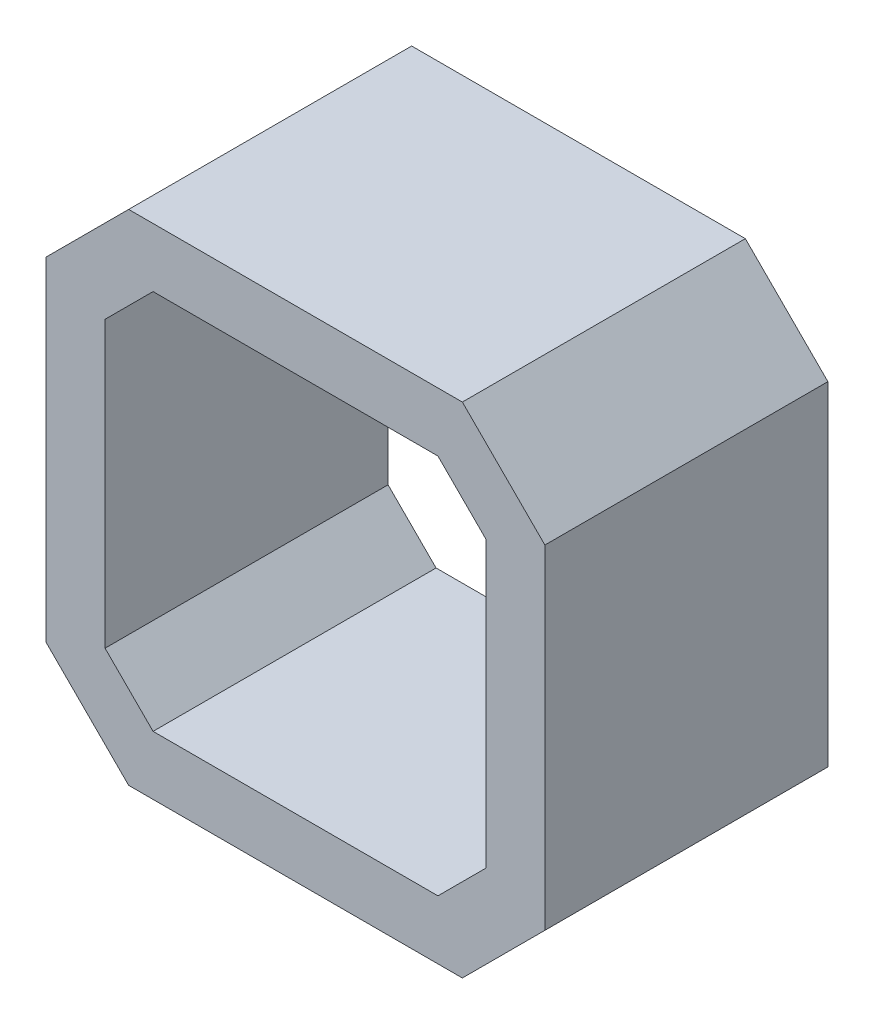
ISO-10303-21;
HEADER;
FILE_DESCRIPTION(('STEP AP214'),'2;1');
FILE_NAME('part.step','',(''),(''),'','','');
FILE_SCHEMA(('AUTOMOTIVE_DESIGN { 1 0 10303 214 1 1 1 1 }'));
ENDSEC;
DATA;
#1=APPLICATION_CONTEXT('core data for automotive mechanical design processes');
#2=APPLICATION_PROTOCOL_DEFINITION('international standard','automotive_design',2000,#1);
#3=PRODUCT_CONTEXT('',#1,'mechanical');
#4=PRODUCT('Part','Part','',(#3));
#5=PRODUCT_RELATED_PRODUCT_CATEGORY('part','',(#4));
#6=PRODUCT_DEFINITION_FORMATION('','',#4);
#7=PRODUCT_DEFINITION_CONTEXT('part definition',#1,'design');
#8=PRODUCT_DEFINITION('design','',#6,#7);
#9=PRODUCT_DEFINITION_SHAPE('','',#8);
#10=(LENGTH_UNIT() NAMED_UNIT(*) SI_UNIT(.MILLI.,.METRE.));
#11=(NAMED_UNIT(*) PLANE_ANGLE_UNIT() SI_UNIT($,.RADIAN.));
#12=(NAMED_UNIT(*) SI_UNIT($,.STERADIAN.) SOLID_ANGLE_UNIT());
#13=UNCERTAINTY_MEASURE_WITH_UNIT(LENGTH_MEASURE(1.E-05),#10,'distance_accuracy_value','');
#14=(GEOMETRIC_REPRESENTATION_CONTEXT(3) GLOBAL_UNCERTAINTY_ASSIGNED_CONTEXT((#13)) GLOBAL_UNIT_ASSIGNED_CONTEXT((#10,
#11,#12)) REPRESENTATION_CONTEXT('',''));
#15=CARTESIAN_POINT('',(0.,0.,0.));
#16=DIRECTION('',(0.,0.,1.));
#17=DIRECTION('',(1.,0.,0.));
#18=AXIS2_PLACEMENT_3D('',#15,#16,#17);
#19=CARTESIAN_POINT('',(0.,0.,24.));
#20=DIRECTION('',(0.,0.,-1.));
#21=DIRECTION('',(-1.,0.,0.));
#22=AXIS2_PLACEMENT_3D('',#19,#20,#21);
#23=PLANE('',#22);
#24=DIRECTION('',(-1.,0.,0.));
#25=VECTOR('',#24,1.);
#26=CARTESIAN_POINT('',(14.15,21.15,24.));
#27=LINE('',#26,#25);
#28=CARTESIAN_POINT('',(14.15,21.15,24.));
#29=VERTEX_POINT('',#28);
#30=CARTESIAN_POINT('',(-14.15,21.15,24.));
#31=VERTEX_POINT('',#30);
#32=EDGE_CURVE('E211',#29,#31,#27,.T.);
#33=ORIENTED_EDGE('',*,*,#32,.T.);
#34=DIRECTION('',(-0.707106781186547,-0.707106781186547,0.));
#35=VECTOR('',#34,1.);
#36=CARTESIAN_POINT('',(-14.15,21.15,24.));
#37=LINE('',#36,#35);
#38=CARTESIAN_POINT('',(-21.15,14.15,24.));
#39=VERTEX_POINT('',#38);
#40=EDGE_CURVE('E214',#31,#39,#37,.T.);
#41=ORIENTED_EDGE('',*,*,#40,.T.);
#42=DIRECTION('',(0.,-1.,0.));
#43=VECTOR('',#42,1.);
#44=CARTESIAN_POINT('',(-21.15,-14.15,24.));
#45=LINE('',#44,#43);
#46=CARTESIAN_POINT('',(-21.15,-14.15,24.));
#47=VERTEX_POINT('',#46);
#48=EDGE_CURVE('E217',#39,#47,#45,.T.);
#49=ORIENTED_EDGE('',*,*,#48,.T.);
#50=DIRECTION('',(0.707106781186547,-0.707106781186547,0.));
#51=VECTOR('',#50,1.);
#52=CARTESIAN_POINT('',(-14.15,-21.15,24.));
#53=LINE('',#52,#51);
#54=CARTESIAN_POINT('',(-14.15,-21.15,24.));
#55=VERTEX_POINT('',#54);
#56=EDGE_CURVE('E219',#47,#55,#53,.T.);
#57=ORIENTED_EDGE('',*,*,#56,.T.);
#58=DIRECTION('',(1.,0.,0.));
#59=VECTOR('',#58,1.);
#60=CARTESIAN_POINT('',(14.15,-21.15,24.));
#61=LINE('',#60,#59);
#62=CARTESIAN_POINT('',(14.15,-21.15,24.));
#63=VERTEX_POINT('',#62);
#64=EDGE_CURVE('E221',#55,#63,#61,.T.);
#65=ORIENTED_EDGE('',*,*,#64,.T.);
#66=DIRECTION('',(0.707106781186547,0.707106781186547,0.));
#67=VECTOR('',#66,1.);
#68=CARTESIAN_POINT('',(21.15,-14.15,24.));
#69=LINE('',#68,#67);
#70=CARTESIAN_POINT('',(21.15,-14.15,24.));
#71=VERTEX_POINT('',#70);
#72=EDGE_CURVE('E223',#63,#71,#69,.T.);
#73=ORIENTED_EDGE('',*,*,#72,.T.);
#74=DIRECTION('',(0.,1.,0.));
#75=VECTOR('',#74,1.);
#76=CARTESIAN_POINT('',(21.15,-14.15,24.));
#77=LINE('',#76,#75);
#78=CARTESIAN_POINT('',(21.15,14.15,24.));
#79=VERTEX_POINT('',#78);
#80=EDGE_CURVE('E225',#71,#79,#77,.T.);
#81=ORIENTED_EDGE('',*,*,#80,.T.);
#82=DIRECTION('',(-0.707106781186547,0.707106781186547,0.));
#83=VECTOR('',#82,1.);
#84=CARTESIAN_POINT('',(21.15,14.15,24.));
#85=LINE('',#84,#83);
#86=EDGE_CURVE('E227',#79,#29,#85,.T.);
#87=ORIENTED_EDGE('',*,*,#86,.T.);
#88=EDGE_LOOP('',(#33,#41,#49,#57,#65,#73,#81,#87));
#89=FACE_BOUND('',#88,.T.);
#90=DIRECTION('',(-1.,0.,0.));
#91=VECTOR('',#90,1.);
#92=CARTESIAN_POINT('',(12.0789321881345,16.15,24.));
#93=LINE('',#92,#91);
#94=CARTESIAN_POINT('',(12.0789321881345,16.15,24.));
#95=VERTEX_POINT('',#94);
#96=CARTESIAN_POINT('',(-12.0789321881345,16.15,24.));
#97=VERTEX_POINT('',#96);
#98=EDGE_CURVE('E146',#95,#97,#93,.T.);
#99=ORIENTED_EDGE('',*,*,#98,.F.);
#100=DIRECTION('',(-0.707106781186547,0.707106781186547,0.));
#101=VECTOR('',#100,1.);
#102=CARTESIAN_POINT('',(16.15,12.0789321881345,24.));
#103=LINE('',#102,#101);
#104=CARTESIAN_POINT('',(16.15,12.0789321881345,24.));
#105=VERTEX_POINT('',#104);
#106=EDGE_CURVE('E179',#105,#95,#103,.T.);
#107=ORIENTED_EDGE('',*,*,#106,.F.);
#108=DIRECTION('',(0.,1.,0.));
#109=VECTOR('',#108,1.);
#110=CARTESIAN_POINT('',(16.15,-12.0789321881345,24.));
#111=LINE('',#110,#109);
#112=CARTESIAN_POINT('',(16.15,-12.0789321881345,24.));
#113=VERTEX_POINT('',#112);
#114=EDGE_CURVE('E177',#113,#105,#111,.T.);
#115=ORIENTED_EDGE('',*,*,#114,.F.);
#116=DIRECTION('',(0.707106781186547,0.707106781186547,0.));
#117=VECTOR('',#116,1.);
#118=CARTESIAN_POINT('',(16.15,-12.0789321881345,24.));
#119=LINE('',#118,#117);
#120=CARTESIAN_POINT('',(12.0789321881345,-16.15,24.));
#121=VERTEX_POINT('',#120);
#122=EDGE_CURVE('E175',#121,#113,#119,.T.);
#123=ORIENTED_EDGE('',*,*,#122,.F.);
#124=DIRECTION('',(1.,0.,0.));
#125=VECTOR('',#124,1.);
#126=CARTESIAN_POINT('',(12.0789321881345,-16.15,24.));
#127=LINE('',#126,#125);
#128=CARTESIAN_POINT('',(-12.0789321881345,-16.15,24.));
#129=VERTEX_POINT('',#128);
#130=EDGE_CURVE('E173',#129,#121,#127,.T.);
#131=ORIENTED_EDGE('',*,*,#130,.F.);
#132=DIRECTION('',(0.707106781186548,-0.707106781186548,0.));
#133=VECTOR('',#132,1.);
#134=CARTESIAN_POINT('',(-12.0789321881345,-16.15,24.));
#135=LINE('',#134,#133);
#136=CARTESIAN_POINT('',(-16.15,-12.0789321881345,24.));
#137=VERTEX_POINT('',#136);
#138=EDGE_CURVE('E169',#137,#129,#135,.T.);
#139=ORIENTED_EDGE('',*,*,#138,.F.);
#140=DIRECTION('',(0.,-1.,0.));
#141=VECTOR('',#140,1.);
#142=CARTESIAN_POINT('',(-16.15,-12.0789321881345,24.));
#143=LINE('',#142,#141);
#144=CARTESIAN_POINT('',(-16.15,12.0789321881345,24.));
#145=VERTEX_POINT('',#144);
#146=EDGE_CURVE('E167',#145,#137,#143,.T.);
#147=ORIENTED_EDGE('',*,*,#146,.F.);
#148=DIRECTION('',(-0.707106781186547,-0.707106781186547,0.));
#149=VECTOR('',#148,1.);
#150=CARTESIAN_POINT('',(-12.0789321881345,16.15,24.));
#151=LINE('',#150,#149);
#152=EDGE_CURVE('E154',#97,#145,#151,.T.);
#153=ORIENTED_EDGE('',*,*,#152,.F.);
#154=EDGE_LOOP('',(#99,#107,#115,#123,#131,#139,#147,#153));
#155=FACE_BOUND('',#154,.T.);
#156=ADVANCED_FACE('F33',(#89,#155),#23,.F.);
#157=CARTESIAN_POINT('',(0.,0.,0.));
#158=DIRECTION('',(0.,0.,-1.));
#159=DIRECTION('',(-1.,0.,0.));
#160=AXIS2_PLACEMENT_3D('',#157,#158,#159);
#161=PLANE('',#160);
#162=DIRECTION('',(-1.,0.,0.));
#163=VECTOR('',#162,1.);
#164=CARTESIAN_POINT('',(14.15,21.15,0.));
#165=LINE('',#164,#163);
#166=CARTESIAN_POINT('',(14.15,21.15,0.));
#167=VERTEX_POINT('',#166);
#168=CARTESIAN_POINT('',(-14.15,21.15,0.));
#169=VERTEX_POINT('',#168);
#170=EDGE_CURVE('E162',#167,#169,#165,.T.);
#171=ORIENTED_EDGE('',*,*,#170,.F.);
#172=DIRECTION('',(-0.707106781186547,0.707106781186547,0.));
#173=VECTOR('',#172,1.);
#174=CARTESIAN_POINT('',(21.15,14.15,0.));
#175=LINE('',#174,#173);
#176=CARTESIAN_POINT('',(21.15,14.15,0.));
#177=VERTEX_POINT('',#176);
#178=EDGE_CURVE('E215',#177,#167,#175,.T.);
#179=ORIENTED_EDGE('',*,*,#178,.F.);
#180=DIRECTION('',(0.,1.,0.));
#181=VECTOR('',#180,1.);
#182=CARTESIAN_POINT('',(21.15,-14.15,0.));
#183=LINE('',#182,#181);
#184=CARTESIAN_POINT('',(21.15,-14.15,0.));
#185=VERTEX_POINT('',#184);
#186=EDGE_CURVE('E242',#185,#177,#183,.T.);
#187=ORIENTED_EDGE('',*,*,#186,.F.);
#188=DIRECTION('',(0.707106781186547,0.707106781186547,0.));
#189=VECTOR('',#188,1.);
#190=CARTESIAN_POINT('',(21.15,-14.15,0.));
#191=LINE('',#190,#189);
#192=CARTESIAN_POINT('',(14.15,-21.15,0.));
#193=VERTEX_POINT('',#192);
#194=EDGE_CURVE('E240',#193,#185,#191,.T.);
#195=ORIENTED_EDGE('',*,*,#194,.F.);
#196=DIRECTION('',(1.,0.,0.));
#197=VECTOR('',#196,1.);
#198=CARTESIAN_POINT('',(14.15,-21.15,0.));
#199=LINE('',#198,#197);
#200=CARTESIAN_POINT('',(-14.15,-21.15,0.));
#201=VERTEX_POINT('',#200);
#202=EDGE_CURVE('E238',#201,#193,#199,.T.);
#203=ORIENTED_EDGE('',*,*,#202,.F.);
#204=DIRECTION('',(0.707106781186547,-0.707106781186547,0.));
#205=VECTOR('',#204,1.);
#206=CARTESIAN_POINT('',(-14.15,-21.15,0.));
#207=LINE('',#206,#205);
#208=CARTESIAN_POINT('',(-21.15,-14.15,0.));
#209=VERTEX_POINT('',#208);
#210=EDGE_CURVE('E236',#209,#201,#207,.T.);
#211=ORIENTED_EDGE('',*,*,#210,.F.);
#212=DIRECTION('',(0.,-1.,0.));
#213=VECTOR('',#212,1.);
#214=CARTESIAN_POINT('',(-21.15,-14.15,0.));
#215=LINE('',#214,#213);
#216=CARTESIAN_POINT('',(-21.15,14.15,0.));
#217=VERTEX_POINT('',#216);
#218=EDGE_CURVE('E234',#217,#209,#215,.T.);
#219=ORIENTED_EDGE('',*,*,#218,.F.);
#220=DIRECTION('',(-0.707106781186547,-0.707106781186547,0.));
#221=VECTOR('',#220,1.);
#222=CARTESIAN_POINT('',(-14.15,21.15,0.));
#223=LINE('',#222,#221);
#224=EDGE_CURVE('E232',#169,#217,#223,.T.);
#225=ORIENTED_EDGE('',*,*,#224,.F.);
#226=EDGE_LOOP('',(#171,#179,#187,#195,#203,#211,#219,#225));
#227=FACE_BOUND('',#226,.T.);
#228=DIRECTION('',(-0.707106781186547,0.707106781186547,0.));
#229=VECTOR('',#228,1.);
#230=CARTESIAN_POINT('',(16.15,12.0789321881345,0.));
#231=LINE('',#230,#229);
#232=CARTESIAN_POINT('',(16.15,12.0789321881345,0.));
#233=VERTEX_POINT('',#232);
#234=CARTESIAN_POINT('',(12.0789321881345,16.15,0.));
#235=VERTEX_POINT('',#234);
#236=EDGE_CURVE('E155',#233,#235,#231,.T.);
#237=ORIENTED_EDGE('',*,*,#236,.T.);
#238=DIRECTION('',(-1.,0.,0.));
#239=VECTOR('',#238,1.);
#240=CARTESIAN_POINT('',(12.0789321881345,16.15,0.));
#241=LINE('',#240,#239);
#242=CARTESIAN_POINT('',(-12.0789321881345,16.15,0.));
#243=VERTEX_POINT('',#242);
#244=EDGE_CURVE('E56',#235,#243,#241,.T.);
#245=ORIENTED_EDGE('',*,*,#244,.T.);
#246=DIRECTION('',(-0.707106781186547,-0.707106781186547,0.));
#247=VECTOR('',#246,1.);
#248=CARTESIAN_POINT('',(-12.0789321881345,16.15,0.));
#249=LINE('',#248,#247);
#250=CARTESIAN_POINT('',(-16.15,12.0789321881345,0.));
#251=VERTEX_POINT('',#250);
#252=EDGE_CURVE('E161',#243,#251,#249,.T.);
#253=ORIENTED_EDGE('',*,*,#252,.T.);
#254=DIRECTION('',(0.,-1.,0.));
#255=VECTOR('',#254,1.);
#256=CARTESIAN_POINT('',(-16.15,-12.0789321881345,0.));
#257=LINE('',#256,#255);
#258=CARTESIAN_POINT('',(-16.15,-12.0789321881345,0.));
#259=VERTEX_POINT('',#258);
#260=EDGE_CURVE('E183',#251,#259,#257,.T.);
#261=ORIENTED_EDGE('',*,*,#260,.T.);
#262=DIRECTION('',(0.707106781186548,-0.707106781186548,0.));
#263=VECTOR('',#262,1.);
#264=CARTESIAN_POINT('',(-12.0789321881345,-16.15,0.));
#265=LINE('',#264,#263);
#266=CARTESIAN_POINT('',(-12.0789321881345,-16.15,0.));
#267=VERTEX_POINT('',#266);
#268=EDGE_CURVE('E186',#259,#267,#265,.T.);
#269=ORIENTED_EDGE('',*,*,#268,.T.);
#270=DIRECTION('',(1.,0.,0.));
#271=VECTOR('',#270,1.);
#272=CARTESIAN_POINT('',(12.0789321881345,-16.15,0.));
#273=LINE('',#272,#271);
#274=CARTESIAN_POINT('',(12.0789321881345,-16.15,0.));
#275=VERTEX_POINT('',#274);
#276=EDGE_CURVE('E189',#267,#275,#273,.T.);
#277=ORIENTED_EDGE('',*,*,#276,.T.);
#278=DIRECTION('',(0.707106781186547,0.707106781186547,0.));
#279=VECTOR('',#278,1.);
#280=CARTESIAN_POINT('',(16.15,-12.0789321881345,0.));
#281=LINE('',#280,#279);
#282=CARTESIAN_POINT('',(16.15,-12.0789321881345,0.));
#283=VERTEX_POINT('',#282);
#284=EDGE_CURVE('E192',#275,#283,#281,.T.);
#285=ORIENTED_EDGE('',*,*,#284,.T.);
#286=DIRECTION('',(0.,1.,0.));
#287=VECTOR('',#286,1.);
#288=CARTESIAN_POINT('',(16.15,-12.0789321881345,0.));
#289=LINE('',#288,#287);
#290=EDGE_CURVE('E195',#283,#233,#289,.T.);
#291=ORIENTED_EDGE('',*,*,#290,.T.);
#292=EDGE_LOOP('',(#237,#245,#253,#261,#269,#277,#285,#291));
#293=FACE_BOUND('',#292,.T.);
#294=ADVANCED_FACE('F272',(#227,#293),#161,.T.);
#295=CARTESIAN_POINT('',(14.15,21.15,24.));
#296=DIRECTION('',(0.,-1.,0.));
#297=DIRECTION('',(0.,0.,-1.));
#298=AXIS2_PLACEMENT_3D('',#295,#296,#297);
#299=PLANE('',#298);
#300=ORIENTED_EDGE('',*,*,#170,.T.);
#301=DIRECTION('',(0.,0.,-1.));
#302=VECTOR('',#301,1.);
#303=CARTESIAN_POINT('',(-14.15,21.15,24.));
#304=LINE('',#303,#302);
#305=EDGE_CURVE('E11',#31,#169,#304,.T.);
#306=ORIENTED_EDGE('',*,*,#305,.F.);
#307=ORIENTED_EDGE('',*,*,#32,.F.);
#308=DIRECTION('',(0.,0.,-1.));
#309=VECTOR('',#308,1.);
#310=CARTESIAN_POINT('',(14.15,21.15,24.));
#311=LINE('',#310,#309);
#312=EDGE_CURVE('E229',#29,#167,#311,.T.);
#313=ORIENTED_EDGE('',*,*,#312,.T.);
#314=EDGE_LOOP('',(#300,#306,#307,#313));
#315=FACE_BOUND('',#314,.T.);
#316=ADVANCED_FACE('F35',(#315),#299,.F.);
#317=CARTESIAN_POINT('',(-14.15,21.15,24.));
#318=DIRECTION('',(0.707106781186548,-0.707106781186548,0.));
#319=DIRECTION('',(0.707106781186548,0.707106781186548,0.));
#320=AXIS2_PLACEMENT_3D('',#317,#318,#319);
#321=PLANE('',#320);
#322=ORIENTED_EDGE('',*,*,#224,.T.);
#323=DIRECTION('',(0.,0.,-1.));
#324=VECTOR('',#323,1.);
#325=CARTESIAN_POINT('',(-21.15,14.15,24.));
#326=LINE('',#325,#324);
#327=EDGE_CURVE('E41',#39,#217,#326,.T.);
#328=ORIENTED_EDGE('',*,*,#327,.F.);
#329=ORIENTED_EDGE('',*,*,#40,.F.);
#330=ORIENTED_EDGE('',*,*,#305,.T.);
#331=EDGE_LOOP('',(#322,#328,#329,#330));
#332=FACE_BOUND('',#331,.T.);
#333=ADVANCED_FACE('F289',(#332),#321,.F.);
#334=CARTESIAN_POINT('',(-21.15,-14.15,24.));
#335=DIRECTION('',(1.,0.,0.));
#336=DIRECTION('',(0.,0.,-1.));
#337=AXIS2_PLACEMENT_3D('',#334,#335,#336);
#338=PLANE('',#337);
#339=ORIENTED_EDGE('',*,*,#218,.T.);
#340=DIRECTION('',(0.,0.,-1.));
#341=VECTOR('',#340,1.);
#342=CARTESIAN_POINT('',(-21.15,-14.15,24.));
#343=LINE('',#342,#341);
#344=EDGE_CURVE('E259',#47,#209,#343,.T.);
#345=ORIENTED_EDGE('',*,*,#344,.F.);
#346=ORIENTED_EDGE('',*,*,#48,.F.);
#347=ORIENTED_EDGE('',*,*,#327,.T.);
#348=EDGE_LOOP('',(#339,#345,#346,#347));
#349=FACE_BOUND('',#348,.T.);
#350=ADVANCED_FACE('F266',(#349),#338,.F.);
#351=CARTESIAN_POINT('',(-14.15,-21.15,24.));
#352=DIRECTION('',(0.707106781186548,0.707106781186548,0.));
#353=DIRECTION('',(-0.707106781186548,0.707106781186548,0.));
#354=AXIS2_PLACEMENT_3D('',#351,#352,#353);
#355=PLANE('',#354);
#356=ORIENTED_EDGE('',*,*,#210,.T.);
#357=DIRECTION('',(0.,0.,-1.));
#358=VECTOR('',#357,1.);
#359=CARTESIAN_POINT('',(-14.15,-21.15,24.));
#360=LINE('',#359,#358);
#361=EDGE_CURVE('E256',#55,#201,#360,.T.);
#362=ORIENTED_EDGE('',*,*,#361,.F.);
#363=ORIENTED_EDGE('',*,*,#56,.F.);
#364=ORIENTED_EDGE('',*,*,#344,.T.);
#365=EDGE_LOOP('',(#356,#362,#363,#364));
#366=FACE_BOUND('',#365,.T.);
#367=ADVANCED_FACE('F278',(#366),#355,.F.);
#368=CARTESIAN_POINT('',(14.15,-21.15,24.));
#369=DIRECTION('',(0.,1.,0.));
#370=DIRECTION('',(-1.,0.,0.));
#371=AXIS2_PLACEMENT_3D('',#368,#369,#370);
#372=PLANE('',#371);
#373=ORIENTED_EDGE('',*,*,#202,.T.);
#374=DIRECTION('',(0.,0.,-1.));
#375=VECTOR('',#374,1.);
#376=CARTESIAN_POINT('',(14.15,-21.15,24.));
#377=LINE('',#376,#375);
#378=EDGE_CURVE('E253',#63,#193,#377,.T.);
#379=ORIENTED_EDGE('',*,*,#378,.F.);
#380=ORIENTED_EDGE('',*,*,#64,.F.);
#381=ORIENTED_EDGE('',*,*,#361,.T.);
#382=EDGE_LOOP('',(#373,#379,#380,#381));
#383=FACE_BOUND('',#382,.T.);
#384=ADVANCED_FACE('F282',(#383),#372,.F.);
#385=CARTESIAN_POINT('',(21.15,-14.15,24.));
#386=DIRECTION('',(-0.707106781186548,0.707106781186548,0.));
#387=DIRECTION('',(-0.707106781186548,-0.707106781186548,0.));
#388=AXIS2_PLACEMENT_3D('',#385,#386,#387);
#389=PLANE('',#388);
#390=ORIENTED_EDGE('',*,*,#194,.T.);
#391=DIRECTION('',(0.,0.,-1.));
#392=VECTOR('',#391,1.);
#393=CARTESIAN_POINT('',(21.15,-14.15,24.));
#394=LINE('',#393,#392);
#395=EDGE_CURVE('E250',#71,#185,#394,.T.);
#396=ORIENTED_EDGE('',*,*,#395,.F.);
#397=ORIENTED_EDGE('',*,*,#72,.F.);
#398=ORIENTED_EDGE('',*,*,#378,.T.);
#399=EDGE_LOOP('',(#390,#396,#397,#398));
#400=FACE_BOUND('',#399,.T.);
#401=ADVANCED_FACE('F302',(#400),#389,.F.);
#402=CARTESIAN_POINT('',(21.15,-14.15,24.));
#403=DIRECTION('',(-1.,0.,0.));
#404=DIRECTION('',(0.,0.,1.));
#405=AXIS2_PLACEMENT_3D('',#402,#403,#404);
#406=PLANE('',#405);
#407=ORIENTED_EDGE('',*,*,#186,.T.);
#408=DIRECTION('',(0.,0.,-1.));
#409=VECTOR('',#408,1.);
#410=CARTESIAN_POINT('',(21.15,14.15,24.));
#411=LINE('',#410,#409);
#412=EDGE_CURVE('E247',#79,#177,#411,.T.);
#413=ORIENTED_EDGE('',*,*,#412,.F.);
#414=ORIENTED_EDGE('',*,*,#80,.F.);
#415=ORIENTED_EDGE('',*,*,#395,.T.);
#416=EDGE_LOOP('',(#407,#413,#414,#415));
#417=FACE_BOUND('',#416,.T.);
#418=ADVANCED_FACE('F300',(#417),#406,.F.);
#419=CARTESIAN_POINT('',(21.15,14.15,24.));
#420=DIRECTION('',(-0.707106781186548,-0.707106781186548,0.));
#421=DIRECTION('',(0.707106781186548,-0.707106781186548,0.));
#422=AXIS2_PLACEMENT_3D('',#419,#420,#421);
#423=PLANE('',#422);
#424=ORIENTED_EDGE('',*,*,#178,.T.);
#425=ORIENTED_EDGE('',*,*,#312,.F.);
#426=ORIENTED_EDGE('',*,*,#86,.F.);
#427=ORIENTED_EDGE('',*,*,#412,.T.);
#428=EDGE_LOOP('',(#424,#425,#426,#427));
#429=FACE_BOUND('',#428,.T.);
#430=ADVANCED_FACE('F295',(#429),#423,.F.);
#431=CARTESIAN_POINT('',(12.0789321881345,16.15,24.));
#432=DIRECTION('',(0.,-1.,0.));
#433=DIRECTION('',(0.,0.,-1.));
#434=AXIS2_PLACEMENT_3D('',#431,#432,#433);
#435=PLANE('',#434);
#436=ORIENTED_EDGE('',*,*,#244,.F.);
#437=DIRECTION('',(0.,0.,-1.));
#438=VECTOR('',#437,1.);
#439=CARTESIAN_POINT('',(12.0789321881345,16.15,24.));
#440=LINE('',#439,#438);
#441=EDGE_CURVE('E150',#95,#235,#440,.T.);
#442=ORIENTED_EDGE('',*,*,#441,.F.);
#443=ORIENTED_EDGE('',*,*,#98,.T.);
#444=DIRECTION('',(0.,0.,-1.));
#445=VECTOR('',#444,1.);
#446=CARTESIAN_POINT('',(-12.0789321881345,16.15,24.));
#447=LINE('',#446,#445);
#448=EDGE_CURVE('E149',#97,#243,#447,.T.);
#449=ORIENTED_EDGE('',*,*,#448,.T.);
#450=EDGE_LOOP('',(#436,#442,#443,#449));
#451=FACE_BOUND('',#450,.T.);
#452=ADVANCED_FACE('F148',(#451),#435,.T.);
#453=CARTESIAN_POINT('',(-12.0789321881345,16.15,24.));
#454=DIRECTION('',(0.707106781186548,-0.707106781186548,0.));
#455=DIRECTION('',(0.707106781186548,0.707106781186548,0.));
#456=AXIS2_PLACEMENT_3D('',#453,#454,#455);
#457=PLANE('',#456);
#458=ORIENTED_EDGE('',*,*,#252,.F.);
#459=ORIENTED_EDGE('',*,*,#448,.F.);
#460=ORIENTED_EDGE('',*,*,#152,.T.);
#461=DIRECTION('',(0.,0.,-1.));
#462=VECTOR('',#461,1.);
#463=CARTESIAN_POINT('',(-16.15,12.0789321881345,24.));
#464=LINE('',#463,#462);
#465=EDGE_CURVE('E163',#145,#251,#464,.T.);
#466=ORIENTED_EDGE('',*,*,#465,.T.);
#467=EDGE_LOOP('',(#458,#459,#460,#466));
#468=FACE_BOUND('',#467,.T.);
#469=ADVANCED_FACE('F158',(#468),#457,.T.);
#470=CARTESIAN_POINT('',(-16.15,-12.0789321881345,24.));
#471=DIRECTION('',(1.,0.,0.));
#472=DIRECTION('',(0.,0.,-1.));
#473=AXIS2_PLACEMENT_3D('',#470,#471,#472);
#474=PLANE('',#473);
#475=ORIENTED_EDGE('',*,*,#260,.F.);
#476=ORIENTED_EDGE('',*,*,#465,.F.);
#477=ORIENTED_EDGE('',*,*,#146,.T.);
#478=DIRECTION('',(0.,0.,-1.));
#479=VECTOR('',#478,1.);
#480=CARTESIAN_POINT('',(-16.15,-12.0789321881345,24.));
#481=LINE('',#480,#479);
#482=EDGE_CURVE('E208',#137,#259,#481,.T.);
#483=ORIENTED_EDGE('',*,*,#482,.T.);
#484=EDGE_LOOP('',(#475,#476,#477,#483));
#485=FACE_BOUND('',#484,.T.);
#486=ADVANCED_FACE('F327',(#485),#474,.T.);
#487=CARTESIAN_POINT('',(-12.0789321881345,-16.15,24.));
#488=DIRECTION('',(0.707106781186547,0.707106781186547,0.));
#489=DIRECTION('',(-0.707106781186548,0.707106781186548,0.));
#490=AXIS2_PLACEMENT_3D('',#487,#488,#489);
#491=PLANE('',#490);
#492=ORIENTED_EDGE('',*,*,#268,.F.);
#493=ORIENTED_EDGE('',*,*,#482,.F.);
#494=ORIENTED_EDGE('',*,*,#138,.T.);
#495=DIRECTION('',(0.,0.,-1.));
#496=VECTOR('',#495,1.);
#497=CARTESIAN_POINT('',(-12.0789321881345,-16.15,24.));
#498=LINE('',#497,#496);
#499=EDGE_CURVE('E206',#129,#267,#498,.T.);
#500=ORIENTED_EDGE('',*,*,#499,.T.);
#501=EDGE_LOOP('',(#492,#493,#494,#500));
#502=FACE_BOUND('',#501,.T.);
#503=ADVANCED_FACE('F331',(#502),#491,.T.);
#504=CARTESIAN_POINT('',(12.0789321881345,-16.15,24.));
#505=DIRECTION('',(0.,1.,0.));
#506=DIRECTION('',(0.,0.,1.));
#507=AXIS2_PLACEMENT_3D('',#504,#505,#506);
#508=PLANE('',#507);
#509=ORIENTED_EDGE('',*,*,#276,.F.);
#510=ORIENTED_EDGE('',*,*,#499,.F.);
#511=ORIENTED_EDGE('',*,*,#130,.T.);
#512=DIRECTION('',(0.,0.,-1.));
#513=VECTOR('',#512,1.);
#514=CARTESIAN_POINT('',(12.0789321881345,-16.15,24.));
#515=LINE('',#514,#513);
#516=EDGE_CURVE('E204',#121,#275,#515,.T.);
#517=ORIENTED_EDGE('',*,*,#516,.T.);
#518=EDGE_LOOP('',(#509,#510,#511,#517));
#519=FACE_BOUND('',#518,.T.);
#520=ADVANCED_FACE('F337',(#519),#508,.T.);
#521=CARTESIAN_POINT('',(16.15,-12.0789321881345,24.));
#522=DIRECTION('',(-0.707106781186548,0.707106781186548,0.));
#523=DIRECTION('',(-0.707106781186548,-0.707106781186548,0.));
#524=AXIS2_PLACEMENT_3D('',#521,#522,#523);
#525=PLANE('',#524);
#526=ORIENTED_EDGE('',*,*,#284,.F.);
#527=ORIENTED_EDGE('',*,*,#516,.F.);
#528=ORIENTED_EDGE('',*,*,#122,.T.);
#529=DIRECTION('',(0.,0.,-1.));
#530=VECTOR('',#529,1.);
#531=CARTESIAN_POINT('',(16.15,-12.0789321881345,24.));
#532=LINE('',#531,#530);
#533=EDGE_CURVE('E202',#113,#283,#532,.T.);
#534=ORIENTED_EDGE('',*,*,#533,.T.);
#535=EDGE_LOOP('',(#526,#527,#528,#534));
#536=FACE_BOUND('',#535,.T.);
#537=ADVANCED_FACE('F341',(#536),#525,.T.);
#538=CARTESIAN_POINT('',(16.15,-12.0789321881345,24.));
#539=DIRECTION('',(-1.,0.,0.));
#540=DIRECTION('',(0.,0.,1.));
#541=AXIS2_PLACEMENT_3D('',#538,#539,#540);
#542=PLANE('',#541);
#543=ORIENTED_EDGE('',*,*,#290,.F.);
#544=ORIENTED_EDGE('',*,*,#533,.F.);
#545=ORIENTED_EDGE('',*,*,#114,.T.);
#546=DIRECTION('',(0.,0.,-1.));
#547=VECTOR('',#546,1.);
#548=CARTESIAN_POINT('',(16.15,12.0789321881345,24.));
#549=LINE('',#548,#547);
#550=EDGE_CURVE('E48',#105,#233,#549,.T.);
#551=ORIENTED_EDGE('',*,*,#550,.T.);
#552=EDGE_LOOP('',(#543,#544,#545,#551));
#553=FACE_BOUND('',#552,.T.);
#554=ADVANCED_FACE('F345',(#553),#542,.T.);
#555=CARTESIAN_POINT('',(16.15,12.0789321881345,24.));
#556=DIRECTION('',(-0.707106781186548,-0.707106781186548,0.));
#557=DIRECTION('',(0.707106781186548,-0.707106781186548,0.));
#558=AXIS2_PLACEMENT_3D('',#555,#556,#557);
#559=PLANE('',#558);
#560=ORIENTED_EDGE('',*,*,#236,.F.);
#561=ORIENTED_EDGE('',*,*,#550,.F.);
#562=ORIENTED_EDGE('',*,*,#106,.T.);
#563=ORIENTED_EDGE('',*,*,#441,.T.);
#564=EDGE_LOOP('',(#560,#561,#562,#563));
#565=FACE_BOUND('',#564,.T.);
#566=ADVANCED_FACE('F349',(#565),#559,.T.);
#567=CLOSED_SHELL('',(#156,#294,#316,#333,#350,#367,#384,#401,#418,#430,#452,#469,#486,#503,
#520,#537,#554,#566));
#568=MANIFOLD_SOLID_BREP('B2',#567);
#569=ADVANCED_BREP_SHAPE_REPRESENTATION('',(#18,#568),#14);
#570=SHAPE_DEFINITION_REPRESENTATION(#9,#569);
ENDSEC;
END-ISO-10303-21;
